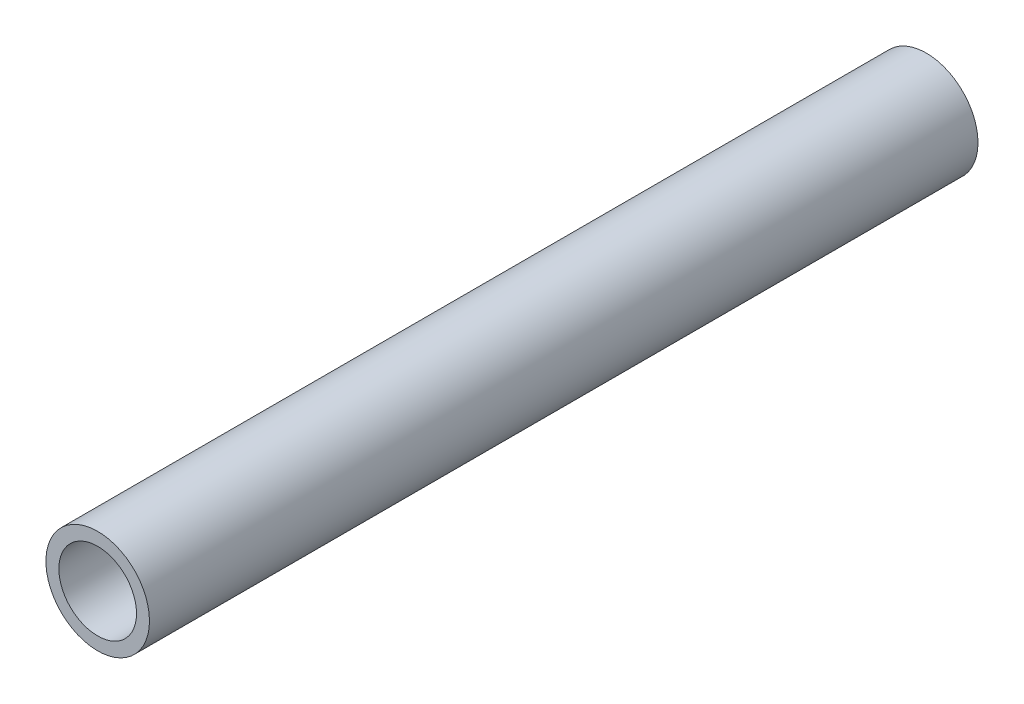
ISO-10303-21;
HEADER;
FILE_DESCRIPTION(('STEP AP214'),'2;1');
FILE_NAME('part.step','',(''),(''),'','','');
FILE_SCHEMA(('AUTOMOTIVE_DESIGN { 1 0 10303 214 1 1 1 1 }'));
ENDSEC;
DATA;
#1=APPLICATION_CONTEXT('core data for automotive mechanical design processes');
#2=APPLICATION_PROTOCOL_DEFINITION('international standard','automotive_design',2000,#1);
#3=PRODUCT_CONTEXT('',#1,'mechanical');
#4=PRODUCT('Part','Part','',(#3));
#5=PRODUCT_RELATED_PRODUCT_CATEGORY('part','',(#4));
#6=PRODUCT_DEFINITION_FORMATION('','',#4);
#7=PRODUCT_DEFINITION_CONTEXT('part definition',#1,'design');
#8=PRODUCT_DEFINITION('design','',#6,#7);
#9=PRODUCT_DEFINITION_SHAPE('','',#8);
#10=(LENGTH_UNIT() NAMED_UNIT(*) SI_UNIT(.MILLI.,.METRE.));
#11=(NAMED_UNIT(*) PLANE_ANGLE_UNIT() SI_UNIT($,.RADIAN.));
#12=(NAMED_UNIT(*) SI_UNIT($,.STERADIAN.) SOLID_ANGLE_UNIT());
#13=UNCERTAINTY_MEASURE_WITH_UNIT(LENGTH_MEASURE(1.E-05),#10,'distance_accuracy_value','');
#14=(GEOMETRIC_REPRESENTATION_CONTEXT(3) GLOBAL_UNCERTAINTY_ASSIGNED_CONTEXT((#13)) GLOBAL_UNIT_ASSIGNED_CONTEXT((#10,
#11,#12)) REPRESENTATION_CONTEXT('',''));
#15=CARTESIAN_POINT('',(0.,0.,0.));
#16=DIRECTION('',(0.,0.,1.));
#17=DIRECTION('',(1.,0.,0.));
#18=AXIS2_PLACEMENT_3D('',#15,#16,#17);
#19=CARTESIAN_POINT('',(0.,0.,80.));
#20=DIRECTION('',(0.,0.,1.));
#21=DIRECTION('',(1.,0.,0.));
#22=AXIS2_PLACEMENT_3D('',#19,#20,#21);
#23=PLANE('',#22);
#24=CARTESIAN_POINT('',(0.,0.,80.));
#25=DIRECTION('',(0.,0.,1.));
#26=DIRECTION('',(1.,0.,0.));
#27=AXIS2_PLACEMENT_3D('',#24,#25,#26);
#28=CIRCLE('',#27,10.);
#29=CARTESIAN_POINT('',(10.,0.,80.));
#30=VERTEX_POINT('',#29);
#31=EDGE_CURVE('E10',#30,#30,#28,.T.);
#32=ORIENTED_EDGE('',*,*,#31,.T.);
#33=EDGE_LOOP('',(#32));
#34=FACE_BOUND('',#33,.T.);
#35=CARTESIAN_POINT('',(0.,0.,80.));
#36=DIRECTION('',(0.,0.,1.));
#37=DIRECTION('',(1.,0.,0.));
#38=AXIS2_PLACEMENT_3D('',#35,#36,#37);
#39=CIRCLE('',#38,7.5);
#40=CARTESIAN_POINT('',(7.5,0.,80.));
#41=VERTEX_POINT('',#40);
#42=EDGE_CURVE('E50',#41,#41,#39,.T.);
#43=ORIENTED_EDGE('',*,*,#42,.F.);
#44=EDGE_LOOP('',(#43));
#45=FACE_BOUND('',#44,.T.);
#46=ADVANCED_FACE('F39',(#34,#45),#23,.T.);
#47=CARTESIAN_POINT('',(0.,0.,-80.));
#48=DIRECTION('',(0.,0.,1.));
#49=DIRECTION('',(1.,0.,0.));
#50=AXIS2_PLACEMENT_3D('',#47,#48,#49);
#51=PLANE('',#50);
#52=CARTESIAN_POINT('',(0.,0.,-80.));
#53=DIRECTION('',(0.,0.,1.));
#54=DIRECTION('',(1.,0.,0.));
#55=AXIS2_PLACEMENT_3D('',#52,#53,#54);
#56=CIRCLE('',#55,10.);
#57=CARTESIAN_POINT('',(10.,0.,-80.));
#58=VERTEX_POINT('',#57);
#59=EDGE_CURVE('E43',#58,#58,#56,.T.);
#60=ORIENTED_EDGE('',*,*,#59,.F.);
#61=EDGE_LOOP('',(#60));
#62=FACE_BOUND('',#61,.T.);
#63=CARTESIAN_POINT('',(0.,0.,-80.));
#64=DIRECTION('',(0.,0.,1.));
#65=DIRECTION('',(1.,0.,0.));
#66=AXIS2_PLACEMENT_3D('',#63,#64,#65);
#67=CIRCLE('',#66,7.5);
#68=CARTESIAN_POINT('',(7.5,0.,-80.));
#69=VERTEX_POINT('',#68);
#70=EDGE_CURVE('E52',#69,#69,#67,.T.);
#71=ORIENTED_EDGE('',*,*,#70,.T.);
#72=EDGE_LOOP('',(#71));
#73=FACE_BOUND('',#72,.T.);
#74=ADVANCED_FACE('F62',(#62,#73),#51,.F.);
#75=CARTESIAN_POINT('',(0.,0.,80.));
#76=DIRECTION('',(0.,0.,-1.));
#77=DIRECTION('',(-1.,0.,0.));
#78=AXIS2_PLACEMENT_3D('',#75,#76,#77);
#79=CYLINDRICAL_SURFACE('',#78,10.);
#80=ORIENTED_EDGE('',*,*,#31,.F.);
#81=EDGE_LOOP('',(#80));
#82=FACE_BOUND('',#81,.T.);
#83=ORIENTED_EDGE('',*,*,#59,.T.);
#84=EDGE_LOOP('',(#83));
#85=FACE_BOUND('',#84,.T.);
#86=ADVANCED_FACE('F41',(#82,#85),#79,.T.);
#87=CARTESIAN_POINT('',(0.,0.,80.));
#88=DIRECTION('',(0.,0.,-1.));
#89=DIRECTION('',(-1.,0.,0.));
#90=AXIS2_PLACEMENT_3D('',#87,#88,#89);
#91=CYLINDRICAL_SURFACE('',#90,7.5);
#92=ORIENTED_EDGE('',*,*,#42,.T.);
#93=EDGE_LOOP('',(#92));
#94=FACE_BOUND('',#93,.T.);
#95=ORIENTED_EDGE('',*,*,#70,.F.);
#96=EDGE_LOOP('',(#95));
#97=FACE_BOUND('',#96,.T.);
#98=ADVANCED_FACE('F58',(#94,#97),#91,.F.);
#99=CLOSED_SHELL('',(#46,#74,#86,#98));
#100=MANIFOLD_SOLID_BREP('B2',#99);
#101=ADVANCED_BREP_SHAPE_REPRESENTATION('',(#18,#100),#14);
#102=SHAPE_DEFINITION_REPRESENTATION(#9,#101);
ENDSEC;
END-ISO-10303-21;
